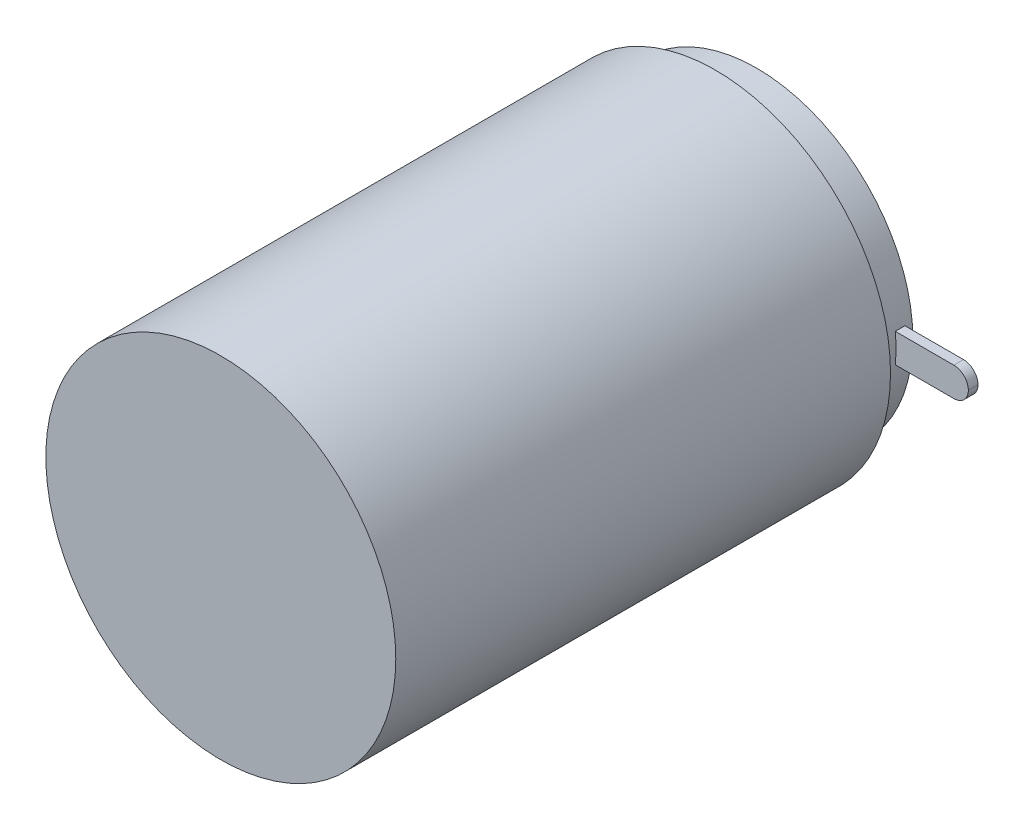
ISO-10303-21;
HEADER;
FILE_DESCRIPTION(('STEP AP214'),'2;1');
FILE_NAME('part.step','',(''),(''),'','','');
FILE_SCHEMA(('AUTOMOTIVE_DESIGN { 1 0 10303 214 1 1 1 1 }'));
ENDSEC;
DATA;
#1=APPLICATION_CONTEXT('core data for automotive mechanical design processes');
#2=APPLICATION_PROTOCOL_DEFINITION('international standard','automotive_design',2000,#1);
#3=PRODUCT_CONTEXT('',#1,'mechanical');
#4=PRODUCT('Part','Part','',(#3));
#5=PRODUCT_RELATED_PRODUCT_CATEGORY('part','',(#4));
#6=PRODUCT_DEFINITION_FORMATION('','',#4);
#7=PRODUCT_DEFINITION_CONTEXT('part definition',#1,'design');
#8=PRODUCT_DEFINITION('design','',#6,#7);
#9=PRODUCT_DEFINITION_SHAPE('','',#8);
#10=(LENGTH_UNIT() NAMED_UNIT(*) SI_UNIT(.MILLI.,.METRE.));
#11=(NAMED_UNIT(*) PLANE_ANGLE_UNIT() SI_UNIT($,.RADIAN.));
#12=(NAMED_UNIT(*) SI_UNIT($,.STERADIAN.) SOLID_ANGLE_UNIT());
#13=UNCERTAINTY_MEASURE_WITH_UNIT(LENGTH_MEASURE(1.E-05),#10,'distance_accuracy_value','');
#14=(GEOMETRIC_REPRESENTATION_CONTEXT(3) GLOBAL_UNCERTAINTY_ASSIGNED_CONTEXT((#13)) GLOBAL_UNIT_ASSIGNED_CONTEXT((#10,
#11,#12)) REPRESENTATION_CONTEXT('',''));
#15=CARTESIAN_POINT('',(0.,0.,0.));
#16=DIRECTION('',(0.,0.,1.));
#17=DIRECTION('',(1.,0.,0.));
#18=AXIS2_PLACEMENT_3D('',#15,#16,#17);
#19=CARTESIAN_POINT('',(0.,0.,0.));
#20=DIRECTION('',(0.,0.,1.));
#21=DIRECTION('',(1.,0.,0.));
#22=AXIS2_PLACEMENT_3D('',#19,#20,#21);
#23=PLANE('',#22);
#24=CARTESIAN_POINT('',(0.,0.,0.));
#25=DIRECTION('',(0.,0.,1.));
#26=DIRECTION('',(1.,0.,0.));
#27=AXIS2_PLACEMENT_3D('',#24,#25,#26);
#28=CIRCLE('',#27,14.5);
#29=CARTESIAN_POINT('',(14.5,0.,0.));
#30=VERTEX_POINT('',#29);
#31=EDGE_CURVE('E192',#30,#30,#28,.T.);
#32=ORIENTED_EDGE('',*,*,#31,.F.);
#33=EDGE_LOOP('',(#32));
#34=FACE_BOUND('',#33,.T.);
#35=CARTESIAN_POINT('',(0.,0.,0.));
#36=DIRECTION('',(0.,0.,1.));
#37=DIRECTION('',(1.,0.,0.));
#38=AXIS2_PLACEMENT_3D('',#35,#36,#37);
#39=CIRCLE('',#38,12.95);
#40=CARTESIAN_POINT('',(12.95,0.,0.));
#41=VERTEX_POINT('',#40);
#42=EDGE_CURVE('E196',#41,#41,#39,.F.);
#43=ORIENTED_EDGE('',*,*,#42,.F.);
#44=EDGE_LOOP('',(#43));
#45=FACE_BOUND('',#44,.T.);
#46=ADVANCED_FACE('F31',(#34,#45),#23,.F.);
#47=CARTESIAN_POINT('',(0.,0.,41.));
#48=DIRECTION('',(0.,0.,-1.));
#49=DIRECTION('',(-1.,0.,0.));
#50=AXIS2_PLACEMENT_3D('',#47,#48,#49);
#51=CYLINDRICAL_SURFACE('',#50,14.5);
#52=CARTESIAN_POINT('',(0.,0.,41.));
#53=DIRECTION('',(0.,0.,1.));
#54=DIRECTION('',(1.,0.,0.));
#55=AXIS2_PLACEMENT_3D('',#52,#53,#54);
#56=CIRCLE('',#55,14.5);
#57=CARTESIAN_POINT('',(14.5,0.,41.));
#58=VERTEX_POINT('',#57);
#59=EDGE_CURVE('E193',#58,#58,#56,.T.);
#60=ORIENTED_EDGE('',*,*,#59,.F.);
#61=EDGE_LOOP('',(#60));
#62=FACE_BOUND('',#61,.T.);
#63=ORIENTED_EDGE('',*,*,#31,.T.);
#64=EDGE_LOOP('',(#63));
#65=FACE_BOUND('',#64,.T.);
#66=ADVANCED_FACE('F241',(#62,#65),#51,.T.);
#67=CARTESIAN_POINT('',(0.,0.,41.));
#68=DIRECTION('',(0.,0.,1.));
#69=DIRECTION('',(1.,0.,0.));
#70=AXIS2_PLACEMENT_3D('',#67,#68,#69);
#71=PLANE('',#70);
#72=ORIENTED_EDGE('',*,*,#59,.T.);
#73=EDGE_LOOP('',(#72));
#74=FACE_BOUND('',#73,.T.);
#75=ADVANCED_FACE('F247',(#74),#71,.T.);
#76=CARTESIAN_POINT('',(0.,0.,-3.4));
#77=DIRECTION('',(0.,0.,1.));
#78=DIRECTION('',(1.,0.,0.));
#79=AXIS2_PLACEMENT_3D('',#76,#77,#78);
#80=CYLINDRICAL_SURFACE('',#79,12.95);
#81=DIRECTION('',(0.,0.,1.));
#82=VECTOR('',#81,1.);
#83=CARTESIAN_POINT('',(-12.8942816783255,1.2,-3.4));
#84=LINE('',#83,#82);
#85=CARTESIAN_POINT('',(-12.8942816783255,1.2,-2.8));
#86=VERTEX_POINT('',#85);
#87=CARTESIAN_POINT('',(-12.8942816783255,1.2,-2.));
#88=VERTEX_POINT('',#87);
#89=EDGE_CURVE('E106',#86,#88,#84,.T.);
#90=ORIENTED_EDGE('',*,*,#89,.T.);
#91=CARTESIAN_POINT('',(0.,0.,-2.));
#92=DIRECTION('',(0.,0.,1.));
#93=DIRECTION('',(0.,-1.,0.));
#94=AXIS2_PLACEMENT_3D('',#91,#92,#93);
#95=CIRCLE('',#94,12.95);
#96=CARTESIAN_POINT('',(-12.8942816783255,-1.2,-2.));
#97=VERTEX_POINT('',#96);
#98=EDGE_CURVE('E128',#88,#97,#95,.T.);
#99=ORIENTED_EDGE('',*,*,#98,.T.);
#100=DIRECTION('',(0.,0.,1.));
#101=VECTOR('',#100,1.);
#102=CARTESIAN_POINT('',(-12.8942816783255,-1.2,-3.4));
#103=LINE('',#102,#101);
#104=CARTESIAN_POINT('',(-12.8942816783255,-1.2,-2.8));
#105=VERTEX_POINT('',#104);
#106=EDGE_CURVE('E126',#97,#105,#103,.F.);
#107=ORIENTED_EDGE('',*,*,#106,.T.);
#108=CARTESIAN_POINT('',(0.,0.,-2.8));
#109=DIRECTION('',(0.,0.,-1.));
#110=DIRECTION('',(0.,1.,0.));
#111=AXIS2_PLACEMENT_3D('',#108,#109,#110);
#112=CIRCLE('',#111,12.95);
#113=EDGE_CURVE('E116',#105,#86,#112,.T.);
#114=ORIENTED_EDGE('',*,*,#113,.T.);
#115=EDGE_LOOP('',(#90,#99,#107,#114));
#116=FACE_BOUND('',#115,.T.);
#117=DIRECTION('',(0.,0.,1.));
#118=VECTOR('',#117,1.);
#119=CARTESIAN_POINT('',(12.8942816783255,1.2,-3.4));
#120=LINE('',#119,#118);
#121=CARTESIAN_POINT('',(12.8942816783255,1.2,-2.));
#122=VERTEX_POINT('',#121);
#123=CARTESIAN_POINT('',(12.8942816783255,1.2,-2.8));
#124=VERTEX_POINT('',#123);
#125=EDGE_CURVE('E201',#122,#124,#120,.F.);
#126=ORIENTED_EDGE('',*,*,#125,.T.);
#127=CARTESIAN_POINT('',(0.,0.,-2.8));
#128=DIRECTION('',(0.,0.,-1.));
#129=DIRECTION('',(0.,1.,0.));
#130=AXIS2_PLACEMENT_3D('',#127,#128,#129);
#131=CIRCLE('',#130,12.95);
#132=CARTESIAN_POINT('',(12.8942816783255,-1.2,-2.8));
#133=VERTEX_POINT('',#132);
#134=EDGE_CURVE('E117',#124,#133,#131,.T.);
#135=ORIENTED_EDGE('',*,*,#134,.T.);
#136=DIRECTION('',(0.,0.,1.));
#137=VECTOR('',#136,1.);
#138=CARTESIAN_POINT('',(12.8942816783255,-1.2,-3.4));
#139=LINE('',#138,#137);
#140=CARTESIAN_POINT('',(12.8942816783255,-1.2,-2.));
#141=VERTEX_POINT('',#140);
#142=EDGE_CURVE('E207',#133,#141,#139,.T.);
#143=ORIENTED_EDGE('',*,*,#142,.T.);
#144=CARTESIAN_POINT('',(0.,0.,-2.));
#145=DIRECTION('',(0.,0.,1.));
#146=DIRECTION('',(0.,-1.,0.));
#147=AXIS2_PLACEMENT_3D('',#144,#145,#146);
#148=CIRCLE('',#147,12.95);
#149=EDGE_CURVE('E204',#141,#122,#148,.T.);
#150=ORIENTED_EDGE('',*,*,#149,.T.);
#151=EDGE_LOOP('',(#126,#135,#143,#150));
#152=FACE_BOUND('',#151,.T.);
#153=CARTESIAN_POINT('',(0.,0.,-3.4));
#154=DIRECTION('',(0.,0.,-1.));
#155=DIRECTION('',(-1.,0.,0.));
#156=AXIS2_PLACEMENT_3D('',#153,#154,#155);
#157=CIRCLE('',#156,12.95);
#158=CARTESIAN_POINT('',(-12.95,0.,-3.4));
#159=VERTEX_POINT('',#158);
#160=EDGE_CURVE('E184',#159,#159,#157,.T.);
#161=ORIENTED_EDGE('',*,*,#160,.F.);
#162=EDGE_LOOP('',(#161));
#163=FACE_BOUND('',#162,.T.);
#164=ORIENTED_EDGE('',*,*,#42,.T.);
#165=EDGE_LOOP('',(#164));
#166=FACE_BOUND('',#165,.T.);
#167=ADVANCED_FACE('F124',(#116,#152,#163,#166),#80,.T.);
#168=CARTESIAN_POINT('',(0.,0.,-3.4));
#169=DIRECTION('',(0.,0.,-1.));
#170=DIRECTION('',(-1.,0.,0.));
#171=AXIS2_PLACEMENT_3D('',#168,#169,#170);
#172=PLANE('',#171);
#173=ORIENTED_EDGE('',*,*,#160,.T.);
#174=EDGE_LOOP('',(#173));
#175=FACE_BOUND('',#174,.T.);
#176=ADVANCED_FACE('F321',(#175),#172,.T.);
#177=CARTESIAN_POINT('',(11.95,1.2,-2.8));
#178=DIRECTION('',(0.,0.,-1.));
#179=DIRECTION('',(0.,1.,0.));
#180=AXIS2_PLACEMENT_3D('',#177,#178,#179);
#181=PLANE('',#180);
#182=CARTESIAN_POINT('',(17.75,0.,-2.8));
#183=DIRECTION('',(0.,0.,-1.));
#184=DIRECTION('',(0.,1.,0.));
#185=AXIS2_PLACEMENT_3D('',#182,#183,#184);
#186=CIRCLE('',#185,1.2);
#187=CARTESIAN_POINT('',(17.75,1.2,-2.8));
#188=VERTEX_POINT('',#187);
#189=CARTESIAN_POINT('',(18.95,0.,-2.8));
#190=VERTEX_POINT('',#189);
#191=EDGE_CURVE('E133',#188,#190,#186,.T.);
#192=ORIENTED_EDGE('',*,*,#191,.T.);
#193=CARTESIAN_POINT('',(17.75,0.,-2.8));
#194=DIRECTION('',(0.,0.,-1.));
#195=DIRECTION('',(0.,1.,0.));
#196=AXIS2_PLACEMENT_3D('',#193,#194,#195);
#197=CIRCLE('',#196,1.2);
#198=CARTESIAN_POINT('',(17.75,-1.2,-2.8));
#199=VERTEX_POINT('',#198);
#200=EDGE_CURVE('E135',#190,#199,#197,.T.);
#201=ORIENTED_EDGE('',*,*,#200,.T.);
#202=DIRECTION('',(1.,0.,0.));
#203=VECTOR('',#202,1.);
#204=CARTESIAN_POINT('',(11.95,-1.2,-2.8));
#205=LINE('',#204,#203);
#206=EDGE_CURVE('E181',#133,#199,#205,.T.);
#207=ORIENTED_EDGE('',*,*,#206,.F.);
#208=ORIENTED_EDGE('',*,*,#134,.F.);
#209=DIRECTION('',(1.,0.,0.));
#210=VECTOR('',#209,1.);
#211=CARTESIAN_POINT('',(11.95,1.2,-2.8));
#212=LINE('',#211,#210);
#213=EDGE_CURVE('E174',#124,#188,#212,.T.);
#214=ORIENTED_EDGE('',*,*,#213,.T.);
#215=EDGE_LOOP('',(#192,#201,#207,#208,#214));
#216=FACE_BOUND('',#215,.T.);
#217=ADVANCED_FACE('F214',(#216),#181,.T.);
#218=CARTESIAN_POINT('',(11.95,-1.2,-2.8));
#219=DIRECTION('',(0.,-1.,0.));
#220=DIRECTION('',(0.,0.,-1.));
#221=AXIS2_PLACEMENT_3D('',#218,#219,#220);
#222=PLANE('',#221);
#223=ORIENTED_EDGE('',*,*,#206,.T.);
#224=DIRECTION('',(0.,0.,-1.));
#225=VECTOR('',#224,1.);
#226=CARTESIAN_POINT('',(17.75,-1.2,-2.));
#227=LINE('',#226,#225);
#228=CARTESIAN_POINT('',(17.75,-1.2,-2.));
#229=VERTEX_POINT('',#228);
#230=EDGE_CURVE('E137',#199,#229,#227,.F.);
#231=ORIENTED_EDGE('',*,*,#230,.T.);
#232=DIRECTION('',(1.,0.,0.));
#233=VECTOR('',#232,1.);
#234=CARTESIAN_POINT('',(11.95,-1.2,-2.));
#235=LINE('',#234,#233);
#236=EDGE_CURVE('E185',#141,#229,#235,.T.);
#237=ORIENTED_EDGE('',*,*,#236,.F.);
#238=ORIENTED_EDGE('',*,*,#142,.F.);
#239=EDGE_LOOP('',(#223,#231,#237,#238));
#240=FACE_BOUND('',#239,.T.);
#241=ADVANCED_FACE('F218',(#240),#222,.T.);
#242=CARTESIAN_POINT('',(11.95,1.2,-2.));
#243=DIRECTION('',(0.,0.,1.));
#244=DIRECTION('',(0.,-1.,0.));
#245=AXIS2_PLACEMENT_3D('',#242,#243,#244);
#246=PLANE('',#245);
#247=ORIENTED_EDGE('',*,*,#236,.T.);
#248=CARTESIAN_POINT('',(17.75,0.,-2.));
#249=DIRECTION('',(0.,0.,1.));
#250=DIRECTION('',(0.,-1.,0.));
#251=AXIS2_PLACEMENT_3D('',#248,#249,#250);
#252=CIRCLE('',#251,1.2);
#253=CARTESIAN_POINT('',(18.95,0.,-2.));
#254=VERTEX_POINT('',#253);
#255=EDGE_CURVE('E142',#229,#254,#252,.T.);
#256=ORIENTED_EDGE('',*,*,#255,.T.);
#257=CARTESIAN_POINT('',(17.75,0.,-2.));
#258=DIRECTION('',(0.,0.,1.));
#259=DIRECTION('',(0.,-1.,0.));
#260=AXIS2_PLACEMENT_3D('',#257,#258,#259);
#261=CIRCLE('',#260,1.2);
#262=CARTESIAN_POINT('',(17.75,1.2,-2.));
#263=VERTEX_POINT('',#262);
#264=EDGE_CURVE('E140',#254,#263,#261,.T.);
#265=ORIENTED_EDGE('',*,*,#264,.T.);
#266=DIRECTION('',(1.,0.,0.));
#267=VECTOR('',#266,1.);
#268=CARTESIAN_POINT('',(11.95,1.2,-2.));
#269=LINE('',#268,#267);
#270=EDGE_CURVE('E177',#122,#263,#269,.T.);
#271=ORIENTED_EDGE('',*,*,#270,.F.);
#272=ORIENTED_EDGE('',*,*,#149,.F.);
#273=EDGE_LOOP('',(#247,#256,#265,#271,#272));
#274=FACE_BOUND('',#273,.T.);
#275=ADVANCED_FACE('F223',(#274),#246,.T.);
#276=CARTESIAN_POINT('',(11.95,1.2,-2.8));
#277=DIRECTION('',(0.,1.,0.));
#278=DIRECTION('',(0.,0.,1.));
#279=AXIS2_PLACEMENT_3D('',#276,#277,#278);
#280=PLANE('',#279);
#281=ORIENTED_EDGE('',*,*,#270,.T.);
#282=DIRECTION('',(0.,0.,1.));
#283=VECTOR('',#282,1.);
#284=CARTESIAN_POINT('',(17.75,1.2,-2.8));
#285=LINE('',#284,#283);
#286=EDGE_CURVE('E144',#263,#188,#285,.F.);
#287=ORIENTED_EDGE('',*,*,#286,.T.);
#288=ORIENTED_EDGE('',*,*,#213,.F.);
#289=ORIENTED_EDGE('',*,*,#125,.F.);
#290=EDGE_LOOP('',(#281,#287,#288,#289));
#291=FACE_BOUND('',#290,.T.);
#292=ADVANCED_FACE('F229',(#291),#280,.T.);
#293=CARTESIAN_POINT('',(-11.95,1.2,-2.));
#294=DIRECTION('',(0.,0.,1.));
#295=DIRECTION('',(0.,-1.,0.));
#296=AXIS2_PLACEMENT_3D('',#293,#294,#295);
#297=PLANE('',#296);
#298=CARTESIAN_POINT('',(-17.75,0.,-2.));
#299=DIRECTION('',(0.,0.,1.));
#300=DIRECTION('',(0.,-1.,0.));
#301=AXIS2_PLACEMENT_3D('',#298,#299,#300);
#302=CIRCLE('',#301,1.2);
#303=CARTESIAN_POINT('',(-17.75,1.2,-2.));
#304=VERTEX_POINT('',#303);
#305=CARTESIAN_POINT('',(-18.95,0.,-2.));
#306=VERTEX_POINT('',#305);
#307=EDGE_CURVE('E146',#304,#306,#302,.T.);
#308=ORIENTED_EDGE('',*,*,#307,.T.);
#309=CARTESIAN_POINT('',(-17.75,0.,-2.));
#310=DIRECTION('',(0.,0.,1.));
#311=DIRECTION('',(0.,-1.,0.));
#312=AXIS2_PLACEMENT_3D('',#309,#310,#311);
#313=CIRCLE('',#312,1.2);
#314=CARTESIAN_POINT('',(-17.75,-1.2,-2.));
#315=VERTEX_POINT('',#314);
#316=EDGE_CURVE('E148',#306,#315,#313,.T.);
#317=ORIENTED_EDGE('',*,*,#316,.T.);
#318=DIRECTION('',(-1.,0.,0.));
#319=VECTOR('',#318,1.);
#320=CARTESIAN_POINT('',(-11.95,-1.2,-2.));
#321=LINE('',#320,#319);
#322=EDGE_CURVE('E172',#97,#315,#321,.T.);
#323=ORIENTED_EDGE('',*,*,#322,.F.);
#324=ORIENTED_EDGE('',*,*,#98,.F.);
#325=DIRECTION('',(-1.,0.,0.));
#326=VECTOR('',#325,1.);
#327=CARTESIAN_POINT('',(-11.95,1.2,-2.));
#328=LINE('',#327,#326);
#329=EDGE_CURVE('E111',#88,#304,#328,.T.);
#330=ORIENTED_EDGE('',*,*,#329,.T.);
#331=EDGE_LOOP('',(#308,#317,#323,#324,#330));
#332=FACE_BOUND('',#331,.T.);
#333=ADVANCED_FACE('F169',(#332),#297,.T.);
#334=CARTESIAN_POINT('',(-11.95,-1.2,-2.));
#335=DIRECTION('',(0.,-1.,0.));
#336=DIRECTION('',(0.,0.,-1.));
#337=AXIS2_PLACEMENT_3D('',#334,#335,#336);
#338=PLANE('',#337);
#339=ORIENTED_EDGE('',*,*,#322,.T.);
#340=DIRECTION('',(0.,0.,1.));
#341=VECTOR('',#340,1.);
#342=CARTESIAN_POINT('',(-17.75,-1.2,-2.8));
#343=LINE('',#342,#341);
#344=CARTESIAN_POINT('',(-17.75,-1.2,-2.8));
#345=VERTEX_POINT('',#344);
#346=EDGE_CURVE('E150',#315,#345,#343,.F.);
#347=ORIENTED_EDGE('',*,*,#346,.T.);
#348=DIRECTION('',(-1.,0.,0.));
#349=VECTOR('',#348,1.);
#350=CARTESIAN_POINT('',(-11.95,-1.2,-2.8));
#351=LINE('',#350,#349);
#352=EDGE_CURVE('E121',#105,#345,#351,.T.);
#353=ORIENTED_EDGE('',*,*,#352,.F.);
#354=ORIENTED_EDGE('',*,*,#106,.F.);
#355=EDGE_LOOP('',(#339,#347,#353,#354));
#356=FACE_BOUND('',#355,.T.);
#357=ADVANCED_FACE('F236',(#356),#338,.T.);
#358=CARTESIAN_POINT('',(-11.95,1.2,-2.8));
#359=DIRECTION('',(0.,0.,-1.));
#360=DIRECTION('',(0.,1.,0.));
#361=AXIS2_PLACEMENT_3D('',#358,#359,#360);
#362=PLANE('',#361);
#363=ORIENTED_EDGE('',*,*,#352,.T.);
#364=CARTESIAN_POINT('',(-17.75,0.,-2.8));
#365=DIRECTION('',(0.,0.,-1.));
#366=DIRECTION('',(0.,1.,0.));
#367=AXIS2_PLACEMENT_3D('',#364,#365,#366);
#368=CIRCLE('',#367,1.2);
#369=CARTESIAN_POINT('',(-18.95,0.,-2.8));
#370=VERTEX_POINT('',#369);
#371=EDGE_CURVE('E40',#345,#370,#368,.T.);
#372=ORIENTED_EDGE('',*,*,#371,.T.);
#373=CARTESIAN_POINT('',(-17.75,0.,-2.8));
#374=DIRECTION('',(0.,0.,-1.));
#375=DIRECTION('',(0.,1.,0.));
#376=AXIS2_PLACEMENT_3D('',#373,#374,#375);
#377=CIRCLE('',#376,1.2);
#378=CARTESIAN_POINT('',(-17.75,1.2,-2.8));
#379=VERTEX_POINT('',#378);
#380=EDGE_CURVE('E48',#370,#379,#377,.T.);
#381=ORIENTED_EDGE('',*,*,#380,.T.);
#382=DIRECTION('',(-1.,0.,0.));
#383=VECTOR('',#382,1.);
#384=CARTESIAN_POINT('',(-11.95,1.2,-2.8));
#385=LINE('',#384,#383);
#386=EDGE_CURVE('E108',#86,#379,#385,.T.);
#387=ORIENTED_EDGE('',*,*,#386,.F.);
#388=ORIENTED_EDGE('',*,*,#113,.F.);
#389=EDGE_LOOP('',(#363,#372,#381,#387,#388));
#390=FACE_BOUND('',#389,.T.);
#391=ADVANCED_FACE('F119',(#390),#362,.T.);
#392=CARTESIAN_POINT('',(-11.95,1.2,-2.));
#393=DIRECTION('',(0.,1.,0.));
#394=DIRECTION('',(0.,0.,1.));
#395=AXIS2_PLACEMENT_3D('',#392,#393,#394);
#396=PLANE('',#395);
#397=ORIENTED_EDGE('',*,*,#386,.T.);
#398=DIRECTION('',(0.,0.,-1.));
#399=VECTOR('',#398,1.);
#400=CARTESIAN_POINT('',(-17.75,1.2,-2.));
#401=LINE('',#400,#399);
#402=EDGE_CURVE('E11',#379,#304,#401,.F.);
#403=ORIENTED_EDGE('',*,*,#402,.T.);
#404=ORIENTED_EDGE('',*,*,#329,.F.);
#405=ORIENTED_EDGE('',*,*,#89,.F.);
#406=EDGE_LOOP('',(#397,#403,#404,#405));
#407=FACE_BOUND('',#406,.T.);
#408=ADVANCED_FACE('F107',(#407),#396,.T.);
#409=CARTESIAN_POINT('',(17.75,0.,-2.8));
#410=DIRECTION('',(0.,0.,-1.));
#411=DIRECTION('',(-1.,0.,0.));
#412=AXIS2_PLACEMENT_3D('',#409,#410,#411);
#413=CYLINDRICAL_SURFACE('',#412,1.2);
#414=ORIENTED_EDGE('',*,*,#286,.F.);
#415=ORIENTED_EDGE('',*,*,#264,.F.);
#416=DIRECTION('',(0.,0.,1.));
#417=VECTOR('',#416,1.);
#418=CARTESIAN_POINT('',(18.95,0.,-2.));
#419=LINE('',#418,#417);
#420=EDGE_CURVE('E154',#190,#254,#419,.T.);
#421=ORIENTED_EDGE('',*,*,#420,.F.);
#422=ORIENTED_EDGE('',*,*,#191,.F.);
#423=EDGE_LOOP('',(#414,#415,#421,#422));
#424=FACE_BOUND('',#423,.T.);
#425=ADVANCED_FACE('F227',(#424),#413,.T.);
#426=CARTESIAN_POINT('',(17.75,0.,-2.8));
#427=DIRECTION('',(0.,0.,1.));
#428=DIRECTION('',(1.,0.,0.));
#429=AXIS2_PLACEMENT_3D('',#426,#427,#428);
#430=CYLINDRICAL_SURFACE('',#429,1.2);
#431=ORIENTED_EDGE('',*,*,#255,.F.);
#432=ORIENTED_EDGE('',*,*,#230,.F.);
#433=ORIENTED_EDGE('',*,*,#200,.F.);
#434=ORIENTED_EDGE('',*,*,#420,.T.);
#435=EDGE_LOOP('',(#431,#432,#433,#434));
#436=FACE_BOUND('',#435,.T.);
#437=ADVANCED_FACE('F220',(#436),#430,.T.);
#438=CARTESIAN_POINT('',(-17.75,0.,-2.));
#439=DIRECTION('',(0.,0.,1.));
#440=DIRECTION('',(0.,-1.,0.));
#441=AXIS2_PLACEMENT_3D('',#438,#439,#440);
#442=CYLINDRICAL_SURFACE('',#441,1.2);
#443=ORIENTED_EDGE('',*,*,#402,.F.);
#444=ORIENTED_EDGE('',*,*,#380,.F.);
#445=DIRECTION('',(0.,0.,-1.));
#446=VECTOR('',#445,1.);
#447=CARTESIAN_POINT('',(-18.95,0.,-2.8));
#448=LINE('',#447,#446);
#449=EDGE_CURVE('E35',#306,#370,#448,.T.);
#450=ORIENTED_EDGE('',*,*,#449,.F.);
#451=ORIENTED_EDGE('',*,*,#307,.F.);
#452=EDGE_LOOP('',(#443,#444,#450,#451));
#453=FACE_BOUND('',#452,.T.);
#454=ADVANCED_FACE('F33',(#453),#442,.T.);
#455=CARTESIAN_POINT('',(-17.75,0.,-2.));
#456=DIRECTION('',(0.,0.,-1.));
#457=DIRECTION('',(0.,1.,0.));
#458=AXIS2_PLACEMENT_3D('',#455,#456,#457);
#459=CYLINDRICAL_SURFACE('',#458,1.2);
#460=ORIENTED_EDGE('',*,*,#371,.F.);
#461=ORIENTED_EDGE('',*,*,#346,.F.);
#462=ORIENTED_EDGE('',*,*,#316,.F.);
#463=ORIENTED_EDGE('',*,*,#449,.T.);
#464=EDGE_LOOP('',(#460,#461,#462,#463));
#465=FACE_BOUND('',#464,.T.);
#466=ADVANCED_FACE('F164',(#465),#459,.T.);
#467=CLOSED_SHELL('',(#46,#66,#75,#167,#176,#217,#241,#275,#292,#333,#357,#391,#408,#425,#437,
#454,#466));
#468=MANIFOLD_SOLID_BREP('B2',#467);
#469=ADVANCED_BREP_SHAPE_REPRESENTATION('',(#18,#468),#14);
#470=SHAPE_DEFINITION_REPRESENTATION(#9,#469);
ENDSEC;
END-ISO-10303-21;
